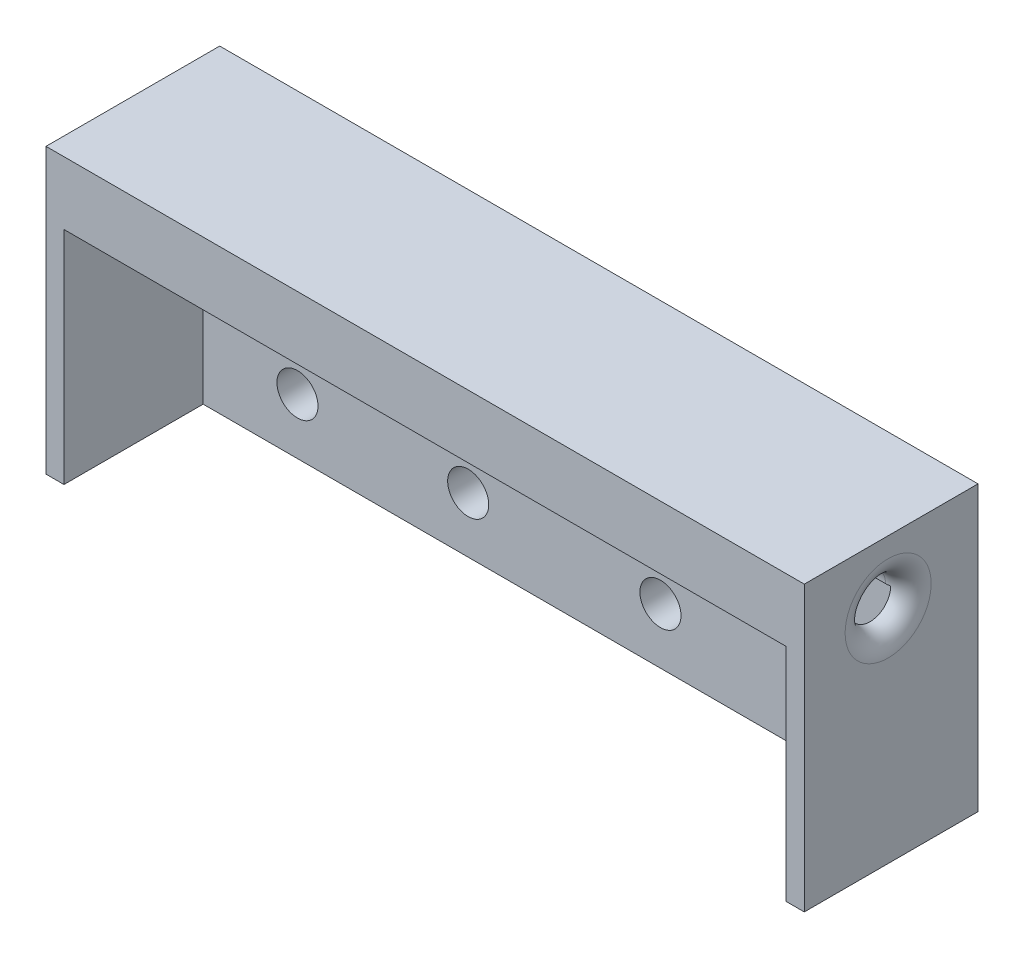
ISO-10303-21;
HEADER;
FILE_DESCRIPTION(('STEP AP214'),'2;1');
FILE_NAME('part.step','',(''),(''),'','','');
FILE_SCHEMA(('AUTOMOTIVE_DESIGN { 1 0 10303 214 1 1 1 1 }'));
ENDSEC;
DATA;
#1=APPLICATION_CONTEXT('core data for automotive mechanical design processes');
#2=APPLICATION_PROTOCOL_DEFINITION('international standard','automotive_design',2000,#1);
#3=PRODUCT_CONTEXT('',#1,'mechanical');
#4=PRODUCT('Part','Part','',(#3));
#5=PRODUCT_RELATED_PRODUCT_CATEGORY('part','',(#4));
#6=PRODUCT_DEFINITION_FORMATION('','',#4);
#7=PRODUCT_DEFINITION_CONTEXT('part definition',#1,'design');
#8=PRODUCT_DEFINITION('design','',#6,#7);
#9=PRODUCT_DEFINITION_SHAPE('','',#8);
#10=(LENGTH_UNIT() NAMED_UNIT(*) SI_UNIT(.MILLI.,.METRE.));
#11=(NAMED_UNIT(*) PLANE_ANGLE_UNIT() SI_UNIT($,.RADIAN.));
#12=(NAMED_UNIT(*) SI_UNIT($,.STERADIAN.) SOLID_ANGLE_UNIT());
#13=UNCERTAINTY_MEASURE_WITH_UNIT(LENGTH_MEASURE(1.E-05),#10,'distance_accuracy_value','');
#14=(GEOMETRIC_REPRESENTATION_CONTEXT(3) GLOBAL_UNCERTAINTY_ASSIGNED_CONTEXT((#13)) GLOBAL_UNIT_ASSIGNED_CONTEXT((#10,
#11,#12)) REPRESENTATION_CONTEXT('',''));
#15=CARTESIAN_POINT('',(0.,0.,0.));
#16=DIRECTION('',(0.,0.,1.));
#17=DIRECTION('',(1.,0.,0.));
#18=AXIS2_PLACEMENT_3D('',#15,#16,#17);
#19=CARTESIAN_POINT('',(0.,0.,9.66666666666667));
#20=DIRECTION('',(1.,0.,0.));
#21=DIRECTION('',(0.,0.,-1.));
#22=AXIS2_PLACEMENT_3D('',#19,#20,#21);
#23=PLANE('',#22);
#24=CARTESIAN_POINT('',(0.,12.3,5.));
#25=DIRECTION('',(1.,0.,0.));
#26=DIRECTION('',(0.,0.,-1.));
#27=AXIS2_PLACEMENT_3D('',#24,#25,#26);
#28=CIRCLE('',#27,2.395);
#29=CARTESIAN_POINT('',(0.,12.3,2.605));
#30=VERTEX_POINT('',#29);
#31=EDGE_CURVE('E244',#30,#30,#28,.T.);
#32=ORIENTED_EDGE('',*,*,#31,.T.);
#33=EDGE_LOOP('',(#32));
#34=FACE_BOUND('',#33,.T.);
#35=DIRECTION('',(0.,-1.,0.));
#36=VECTOR('',#35,1.);
#37=CARTESIAN_POINT('',(0.,0.,0.));
#38=LINE('',#37,#36);
#39=CARTESIAN_POINT('',(0.,15.8,0.));
#40=VERTEX_POINT('',#39);
#41=CARTESIAN_POINT('',(0.,0.,0.));
#42=VERTEX_POINT('',#41);
#43=EDGE_CURVE('E158',#40,#42,#38,.T.);
#44=ORIENTED_EDGE('',*,*,#43,.T.);
#45=DIRECTION('',(0.,0.,-1.));
#46=VECTOR('',#45,1.);
#47=CARTESIAN_POINT('',(0.,0.,9.66666666666667));
#48=LINE('',#47,#46);
#49=CARTESIAN_POINT('',(0.,0.,9.66666666666667));
#50=VERTEX_POINT('',#49);
#51=EDGE_CURVE('E234',#50,#42,#48,.T.);
#52=ORIENTED_EDGE('',*,*,#51,.F.);
#53=DIRECTION('',(0.,-1.,0.));
#54=VECTOR('',#53,1.);
#55=CARTESIAN_POINT('',(0.,0.,9.66666666666667));
#56=LINE('',#55,#54);
#57=CARTESIAN_POINT('',(0.,15.8,9.66666666666667));
#58=VERTEX_POINT('',#57);
#59=EDGE_CURVE('E195',#58,#50,#56,.T.);
#60=ORIENTED_EDGE('',*,*,#59,.F.);
#61=DIRECTION('',(0.,0.,-1.));
#62=VECTOR('',#61,1.);
#63=CARTESIAN_POINT('',(0.,15.8,9.66666666666667));
#64=LINE('',#63,#62);
#65=EDGE_CURVE('E211',#58,#40,#64,.T.);
#66=ORIENTED_EDGE('',*,*,#65,.T.);
#67=EDGE_LOOP('',(#44,#52,#60,#66));
#68=FACE_BOUND('',#67,.T.);
#69=ADVANCED_FACE('F45',(#34,#68),#23,.F.);
#70=CARTESIAN_POINT('',(0.,0.,9.66666666666667));
#71=DIRECTION('',(0.,1.,0.));
#72=DIRECTION('',(0.,0.,1.));
#73=AXIS2_PLACEMENT_3D('',#70,#71,#72);
#74=PLANE('',#73);
#75=DIRECTION('',(1.,0.,0.));
#76=VECTOR('',#75,1.);
#77=CARTESIAN_POINT('',(0.,0.,9.66666666666667));
#78=LINE('',#77,#76);
#79=CARTESIAN_POINT('',(41.1894,0.,9.66666666666667));
#80=VERTEX_POINT('',#79);
#81=CARTESIAN_POINT('',(42.2,0.,9.66666666666667));
#82=VERTEX_POINT('',#81);
#83=EDGE_CURVE('E199',#80,#82,#78,.T.);
#84=ORIENTED_EDGE('',*,*,#83,.F.);
#85=DIRECTION('',(0.,0.,1.));
#86=VECTOR('',#85,1.);
#87=CARTESIAN_POINT('',(41.1894,0.,1.92110906866666));
#88=LINE('',#87,#86);
#89=CARTESIAN_POINT('',(41.1894,0.,1.92110906866666));
#90=VERTEX_POINT('',#89);
#91=EDGE_CURVE('E192',#90,#80,#88,.T.);
#92=ORIENTED_EDGE('',*,*,#91,.F.);
#93=DIRECTION('',(1.,0.,0.));
#94=VECTOR('',#93,1.);
#95=CARTESIAN_POINT('',(1.,0.,1.92110906866666));
#96=LINE('',#95,#94);
#97=CARTESIAN_POINT('',(1.,0.,1.92110906866666));
#98=VERTEX_POINT('',#97);
#99=EDGE_CURVE('E163',#98,#90,#96,.T.);
#100=ORIENTED_EDGE('',*,*,#99,.F.);
#101=DIRECTION('',(0.,0.,1.));
#102=VECTOR('',#101,1.);
#103=CARTESIAN_POINT('',(1.,0.,1.92110906866666));
#104=LINE('',#103,#102);
#105=CARTESIAN_POINT('',(1.,0.,9.66666666666667));
#106=VERTEX_POINT('',#105);
#107=EDGE_CURVE('E188',#98,#106,#104,.T.);
#108=ORIENTED_EDGE('',*,*,#107,.T.);
#109=EDGE_CURVE('E201',#50,#106,#78,.T.);
#110=ORIENTED_EDGE('',*,*,#109,.F.);
#111=ORIENTED_EDGE('',*,*,#51,.T.);
#112=DIRECTION('',(1.,0.,0.));
#113=VECTOR('',#112,1.);
#114=CARTESIAN_POINT('',(0.,0.,0.));
#115=LINE('',#114,#113);
#116=CARTESIAN_POINT('',(42.2,0.,0.));
#117=VERTEX_POINT('',#116);
#118=EDGE_CURVE('E215',#42,#117,#115,.T.);
#119=ORIENTED_EDGE('',*,*,#118,.T.);
#120=DIRECTION('',(0.,0.,-1.));
#121=VECTOR('',#120,1.);
#122=CARTESIAN_POINT('',(42.2,0.,9.66666666666667));
#123=LINE('',#122,#121);
#124=EDGE_CURVE('E230',#82,#117,#123,.T.);
#125=ORIENTED_EDGE('',*,*,#124,.F.);
#126=EDGE_LOOP('',(#84,#92,#100,#108,#110,#111,#119,#125));
#127=FACE_BOUND('',#126,.T.);
#128=ADVANCED_FACE('F303',(#127),#74,.F.);
#129=CARTESIAN_POINT('',(42.2,0.,9.66666666666667));
#130=DIRECTION('',(-1.,0.,0.));
#131=DIRECTION('',(0.,0.,1.));
#132=AXIS2_PLACEMENT_3D('',#129,#130,#131);
#133=PLANE('',#132);
#134=CARTESIAN_POINT('',(42.2,12.3,5.));
#135=DIRECTION('',(-1.,0.,0.));
#136=DIRECTION('',(0.,0.,1.));
#137=AXIS2_PLACEMENT_3D('',#134,#135,#136);
#138=CIRCLE('',#137,2.395);
#139=CARTESIAN_POINT('',(42.2,12.3,7.395));
#140=VERTEX_POINT('',#139);
#141=EDGE_CURVE('E56',#140,#140,#138,.T.);
#142=ORIENTED_EDGE('',*,*,#141,.T.);
#143=EDGE_LOOP('',(#142));
#144=FACE_BOUND('',#143,.T.);
#145=DIRECTION('',(0.,1.,0.));
#146=VECTOR('',#145,1.);
#147=CARTESIAN_POINT('',(42.2,0.,0.));
#148=LINE('',#147,#146);
#149=CARTESIAN_POINT('',(42.2,15.8,0.));
#150=VERTEX_POINT('',#149);
#151=EDGE_CURVE('E218',#117,#150,#148,.T.);
#152=ORIENTED_EDGE('',*,*,#151,.T.);
#153=DIRECTION('',(0.,0.,-1.));
#154=VECTOR('',#153,1.);
#155=CARTESIAN_POINT('',(42.2,15.8,9.66666666666667));
#156=LINE('',#155,#154);
#157=CARTESIAN_POINT('',(42.2,15.8,9.66666666666667));
#158=VERTEX_POINT('',#157);
#159=EDGE_CURVE('E226',#158,#150,#156,.T.);
#160=ORIENTED_EDGE('',*,*,#159,.F.);
#161=DIRECTION('',(0.,1.,0.));
#162=VECTOR('',#161,1.);
#163=CARTESIAN_POINT('',(42.2,0.,9.66666666666667));
#164=LINE('',#163,#162);
#165=EDGE_CURVE('E205',#82,#158,#164,.T.);
#166=ORIENTED_EDGE('',*,*,#165,.F.);
#167=ORIENTED_EDGE('',*,*,#124,.T.);
#168=EDGE_LOOP('',(#152,#160,#166,#167));
#169=FACE_BOUND('',#168,.T.);
#170=ADVANCED_FACE('F307',(#144,#169),#133,.F.);
#171=CARTESIAN_POINT('',(0.,15.8,9.66666666666667));
#172=DIRECTION('',(0.,-1.,0.));
#173=DIRECTION('',(0.,0.,-1.));
#174=AXIS2_PLACEMENT_3D('',#171,#172,#173);
#175=PLANE('',#174);
#176=DIRECTION('',(-1.,0.,0.));
#177=VECTOR('',#176,1.);
#178=CARTESIAN_POINT('',(0.,15.8,0.));
#179=LINE('',#178,#177);
#180=EDGE_CURVE('E200',#150,#40,#179,.T.);
#181=ORIENTED_EDGE('',*,*,#180,.T.);
#182=ORIENTED_EDGE('',*,*,#65,.F.);
#183=DIRECTION('',(-1.,0.,0.));
#184=VECTOR('',#183,1.);
#185=CARTESIAN_POINT('',(0.,15.8,9.66666666666667));
#186=LINE('',#185,#184);
#187=EDGE_CURVE('E208',#158,#58,#186,.T.);
#188=ORIENTED_EDGE('',*,*,#187,.F.);
#189=ORIENTED_EDGE('',*,*,#159,.T.);
#190=EDGE_LOOP('',(#181,#182,#188,#189));
#191=FACE_BOUND('',#190,.T.);
#192=ADVANCED_FACE('F311',(#191),#175,.F.);
#193=CARTESIAN_POINT('',(0.,0.,9.66666666666667));
#194=DIRECTION('',(0.,0.,-1.));
#195=DIRECTION('',(-1.,0.,0.));
#196=AXIS2_PLACEMENT_3D('',#193,#194,#195);
#197=PLANE('',#196);
#198=DIRECTION('',(1.,0.,0.));
#199=VECTOR('',#198,1.);
#200=CARTESIAN_POINT('',(1.,12.2936,9.66666666666667));
#201=LINE('',#200,#199);
#202=CARTESIAN_POINT('',(1.,12.2936,9.66666666666667));
#203=VERTEX_POINT('',#202);
#204=CARTESIAN_POINT('',(41.1894,12.2936,9.66666666666667));
#205=VERTEX_POINT('',#204);
#206=EDGE_CURVE('E175',#203,#205,#201,.T.);
#207=ORIENTED_EDGE('',*,*,#206,.T.);
#208=DIRECTION('',(0.,1.,0.));
#209=VECTOR('',#208,1.);
#210=CARTESIAN_POINT('',(41.1894,0.,9.66666666666667));
#211=LINE('',#210,#209);
#212=EDGE_CURVE('E179',#80,#205,#211,.T.);
#213=ORIENTED_EDGE('',*,*,#212,.F.);
#214=ORIENTED_EDGE('',*,*,#83,.T.);
#215=ORIENTED_EDGE('',*,*,#165,.T.);
#216=ORIENTED_EDGE('',*,*,#187,.T.);
#217=ORIENTED_EDGE('',*,*,#59,.T.);
#218=ORIENTED_EDGE('',*,*,#109,.T.);
#219=DIRECTION('',(0.,1.,0.));
#220=VECTOR('',#219,1.);
#221=CARTESIAN_POINT('',(1.,0.,9.66666666666667));
#222=LINE('',#221,#220);
#223=EDGE_CURVE('E151',#106,#203,#222,.T.);
#224=ORIENTED_EDGE('',*,*,#223,.T.);
#225=EDGE_LOOP('',(#207,#213,#214,#215,#216,#217,#218,#224));
#226=FACE_BOUND('',#225,.T.);
#227=ADVANCED_FACE('F315',(#226),#197,.F.);
#228=CARTESIAN_POINT('',(0.,0.,0.));
#229=DIRECTION('',(0.,0.,-1.));
#230=DIRECTION('',(-1.,0.,0.));
#231=AXIS2_PLACEMENT_3D('',#228,#229,#230);
#232=PLANE('',#231);
#233=CARTESIAN_POINT('',(6.25,3.1,0.));
#234=DIRECTION('',(0.,0.,1.));
#235=DIRECTION('',(1.,0.,0.));
#236=AXIS2_PLACEMENT_3D('',#233,#234,#235);
#237=CIRCLE('',#236,1.143);
#238=CARTESIAN_POINT('',(7.393,3.1,0.));
#239=VERTEX_POINT('',#238);
#240=EDGE_CURVE('E486',#239,#239,#237,.T.);
#241=ORIENTED_EDGE('',*,*,#240,.T.);
#242=EDGE_LOOP('',(#241));
#243=FACE_BOUND('',#242,.T.);
#244=CARTESIAN_POINT('',(15.75,3.1,0.));
#245=DIRECTION('',(0.,0.,1.));
#246=DIRECTION('',(1.,0.,0.));
#247=AXIS2_PLACEMENT_3D('',#244,#245,#246);
#248=CIRCLE('',#247,1.143);
#249=CARTESIAN_POINT('',(16.893,3.1,0.));
#250=VERTEX_POINT('',#249);
#251=EDGE_CURVE('E489',#250,#250,#248,.T.);
#252=ORIENTED_EDGE('',*,*,#251,.T.);
#253=EDGE_LOOP('',(#252));
#254=FACE_BOUND('',#253,.T.);
#255=CARTESIAN_POINT('',(26.45,3.1,0.));
#256=DIRECTION('',(0.,0.,1.));
#257=DIRECTION('',(1.,0.,0.));
#258=AXIS2_PLACEMENT_3D('',#255,#256,#257);
#259=CIRCLE('',#258,1.143);
#260=CARTESIAN_POINT('',(27.593,3.1,0.));
#261=VERTEX_POINT('',#260);
#262=EDGE_CURVE('E496',#261,#261,#259,.T.);
#263=ORIENTED_EDGE('',*,*,#262,.T.);
#264=EDGE_LOOP('',(#263));
#265=FACE_BOUND('',#264,.T.);
#266=CARTESIAN_POINT('',(35.95,3.1,0.));
#267=DIRECTION('',(0.,0.,1.));
#268=DIRECTION('',(1.,0.,0.));
#269=AXIS2_PLACEMENT_3D('',#266,#267,#268);
#270=CIRCLE('',#269,1.143);
#271=CARTESIAN_POINT('',(37.093,3.1,0.));
#272=VERTEX_POINT('',#271);
#273=EDGE_CURVE('E501',#272,#272,#270,.T.);
#274=ORIENTED_EDGE('',*,*,#273,.T.);
#275=EDGE_LOOP('',(#274));
#276=FACE_BOUND('',#275,.T.);
#277=ORIENTED_EDGE('',*,*,#43,.F.);
#278=ORIENTED_EDGE('',*,*,#180,.F.);
#279=ORIENTED_EDGE('',*,*,#151,.F.);
#280=ORIENTED_EDGE('',*,*,#118,.F.);
#281=EDGE_LOOP('',(#277,#278,#279,#280));
#282=FACE_BOUND('',#281,.T.);
#283=ADVANCED_FACE('F317',(#243,#254,#265,#276,#282),#232,.T.);
#284=CARTESIAN_POINT('',(0.,12.3,5.));
#285=DIRECTION('',(1.,0.,0.));
#286=DIRECTION('',(0.,0.,-1.));
#287=AXIS2_PLACEMENT_3D('',#284,#285,#286);
#288=CYLINDRICAL_SURFACE('',#287,1.125);
#289=DIRECTION('',(1.,0.,0.));
#290=VECTOR('',#289,1.);
#291=CARTESIAN_POINT('',(0.,12.2936,6.12498179540827));
#292=LINE('',#291,#290);
#293=CARTESIAN_POINT('',(1.27,12.2936,6.12498179540827));
#294=VERTEX_POINT('',#293);
#295=CARTESIAN_POINT('',(40.93,12.2936,6.12498179540827));
#296=VERTEX_POINT('',#295);
#297=EDGE_CURVE('E238',#294,#296,#292,.T.);
#298=ORIENTED_EDGE('',*,*,#297,.F.);
#299=CARTESIAN_POINT('',(1.27,12.3,5.));
#300=DIRECTION('',(1.,0.,0.));
#301=DIRECTION('',(0.,0.,-1.));
#302=AXIS2_PLACEMENT_3D('',#299,#300,#301);
#303=CIRCLE('',#302,1.125);
#304=CARTESIAN_POINT('',(1.27,12.2936,3.87501820459173));
#305=VERTEX_POINT('',#304);
#306=EDGE_CURVE('E252',#294,#305,#303,.F.);
#307=ORIENTED_EDGE('',*,*,#306,.T.);
#308=DIRECTION('',(1.,0.,0.));
#309=VECTOR('',#308,1.);
#310=CARTESIAN_POINT('',(0.,12.2936,3.87501820459173));
#311=LINE('',#310,#309);
#312=CARTESIAN_POINT('',(40.93,12.2936,3.87501820459173));
#313=VERTEX_POINT('',#312);
#314=EDGE_CURVE('E241',#313,#305,#311,.F.);
#315=ORIENTED_EDGE('',*,*,#314,.F.);
#316=CARTESIAN_POINT('',(40.93,12.3,5.));
#317=DIRECTION('',(-1.,0.,0.));
#318=DIRECTION('',(0.,0.,1.));
#319=AXIS2_PLACEMENT_3D('',#316,#317,#318);
#320=CIRCLE('',#319,1.125);
#321=EDGE_CURVE('E248',#313,#296,#320,.F.);
#322=ORIENTED_EDGE('',*,*,#321,.T.);
#323=EDGE_LOOP('',(#298,#307,#315,#322));
#324=FACE_BOUND('',#323,.T.);
#325=ADVANCED_FACE('F275',(#324),#288,.F.);
#326=CARTESIAN_POINT('',(1.,12.2936,1.92110906866666));
#327=DIRECTION('',(0.,-1.,0.));
#328=DIRECTION('',(0.,0.,-1.));
#329=AXIS2_PLACEMENT_3D('',#326,#327,#328);
#330=PLANE('',#329);
#331=ORIENTED_EDGE('',*,*,#314,.T.);
#332=CARTESIAN_POINT('',(1.27,12.2936,3.87501820459173));
#333=CARTESIAN_POINT('',(1.22448117449185,12.2936,3.87500429410601));
#334=CARTESIAN_POINT('',(1.17922176173839,12.2936,3.87257791441404));
#335=CARTESIAN_POINT('',(1.08922176173836,12.2936,3.86290021661731));
#336=CARTESIAN_POINT('',(1.04448117449182,12.2936,3.85564889851228));
#337=CARTESIAN_POINT('',(1.,12.2936,3.84598511120073));
#338=B_SPLINE_CURVE_WITH_KNOTS('',3,(#332,#333,#334,#335,#336,#337),.UNSPECIFIED.,.F.,.F.,(4,2,
4),(0.,0.135973217402466,0.271946434812479),.UNSPECIFIED.);
#339=CARTESIAN_POINT('',(1.,12.2936,3.84598511120073));
#340=VERTEX_POINT('',#339);
#341=EDGE_CURVE('E264',#305,#340,#338,.T.);
#342=ORIENTED_EDGE('',*,*,#341,.T.);
#343=DIRECTION('',(0.,0.,1.));
#344=VECTOR('',#343,1.);
#345=CARTESIAN_POINT('',(1.,12.2936,1.92110906866666));
#346=LINE('',#345,#344);
#347=CARTESIAN_POINT('',(1.,12.2936,1.92110906866666));
#348=VERTEX_POINT('',#347);
#349=EDGE_CURVE('E145',#348,#340,#346,.T.);
#350=ORIENTED_EDGE('',*,*,#349,.F.);
#351=DIRECTION('',(1.,0.,0.));
#352=VECTOR('',#351,1.);
#353=CARTESIAN_POINT('',(1.,12.2936,1.92110906866666));
#354=LINE('',#353,#352);
#355=CARTESIAN_POINT('',(41.1894,12.2936,1.92110906866666));
#356=VERTEX_POINT('',#355);
#357=EDGE_CURVE('E139',#348,#356,#354,.T.);
#358=ORIENTED_EDGE('',*,*,#357,.T.);
#359=DIRECTION('',(0.,0.,1.));
#360=VECTOR('',#359,1.);
#361=CARTESIAN_POINT('',(41.1894,12.2936,1.92110906866666));
#362=LINE('',#361,#360);
#363=CARTESIAN_POINT('',(41.1894,12.2936,3.8482440842186));
#364=VERTEX_POINT('',#363);
#365=EDGE_CURVE('E143',#356,#364,#362,.T.);
#366=ORIENTED_EDGE('',*,*,#365,.T.);
#367=CARTESIAN_POINT('',(41.1894,12.2936,3.8482440842186));
#368=CARTESIAN_POINT('',(41.1466260305433,12.2936,3.85715696626627));
#369=CARTESIAN_POINT('',(41.1036223791479,12.2936,3.86384458398786));
#370=CARTESIAN_POINT('',(41.0171557124812,12.2936,3.87276929077871));
#371=CARTESIAN_POINT('',(40.97369269721,12.2936,3.87500637984816));
#372=CARTESIAN_POINT('',(40.93,12.2936,3.87501820459173));
#373=B_SPLINE_CURVE_WITH_KNOTS('',3,(#367,#368,#369,#370,#371,#372),.UNSPECIFIED.,.F.,.F.,(4,2,
4),(0.,0.130561649718449,0.261123299431207),.UNSPECIFIED.);
#374=EDGE_CURVE('E256',#364,#313,#373,.T.);
#375=ORIENTED_EDGE('',*,*,#374,.T.);
#376=EDGE_LOOP('',(#331,#342,#350,#358,#366,#375));
#377=FACE_BOUND('',#376,.T.);
#378=ADVANCED_FACE('F142',(#377),#330,.T.);
#379=CARTESIAN_POINT('',(1.,12.2936,6.15401488879927));
#380=VERTEX_POINT('',#379);
#381=EDGE_CURVE('E174',#380,#203,#346,.T.);
#382=ORIENTED_EDGE('',*,*,#381,.F.);
#383=CARTESIAN_POINT('',(1.,12.2936,6.15401488879927));
#384=CARTESIAN_POINT('',(1.04448117449182,12.2936,6.14435110148772));
#385=CARTESIAN_POINT('',(1.08922176173836,12.2936,6.13709978338269));
#386=CARTESIAN_POINT('',(1.17922176173839,12.2936,6.12742208558596));
#387=CARTESIAN_POINT('',(1.22448117449185,12.2936,6.12499570589399));
#388=CARTESIAN_POINT('',(1.27,12.2936,6.12498179540827));
#389=B_SPLINE_CURVE_WITH_KNOTS('',3,(#383,#384,#385,#386,#387,#388),.UNSPECIFIED.,.F.,.F.,(4,2,
4),(0.,0.135973217410013,0.271946434812478),.UNSPECIFIED.);
#390=EDGE_CURVE('E288',#380,#294,#389,.T.);
#391=ORIENTED_EDGE('',*,*,#390,.T.);
#392=ORIENTED_EDGE('',*,*,#297,.T.);
#393=CARTESIAN_POINT('',(40.93,12.2936,6.12498179540827));
#394=CARTESIAN_POINT('',(40.97369269721,12.2936,6.12499362015184));
#395=CARTESIAN_POINT('',(41.0171557124812,12.2936,6.12723070922129));
#396=CARTESIAN_POINT('',(41.1036223791479,12.2936,6.13615541601214));
#397=CARTESIAN_POINT('',(41.1466260305433,12.2936,6.14284303373373));
#398=CARTESIAN_POINT('',(41.1894,12.2936,6.1517559157814));
#399=B_SPLINE_CURVE_WITH_KNOTS('',3,(#393,#394,#395,#396,#397,#398),.UNSPECIFIED.,.F.,.F.,(4,2,
4),(0.,0.130561649712758,0.261123299431207),.UNSPECIFIED.);
#400=CARTESIAN_POINT('',(41.1894,12.2936,6.1517559157814));
#401=VERTEX_POINT('',#400);
#402=EDGE_CURVE('E64',#296,#401,#399,.T.);
#403=ORIENTED_EDGE('',*,*,#402,.T.);
#404=EDGE_CURVE('E159',#401,#205,#362,.T.);
#405=ORIENTED_EDGE('',*,*,#404,.T.);
#406=ORIENTED_EDGE('',*,*,#206,.F.);
#407=EDGE_LOOP('',(#382,#391,#392,#403,#405,#406));
#408=FACE_BOUND('',#407,.T.);
#409=ADVANCED_FACE('F274',(#408),#330,.T.);
#410=CARTESIAN_POINT('',(41.1894,0.,1.92110906866666));
#411=DIRECTION('',(1.,0.,0.));
#412=DIRECTION('',(0.,0.,-1.));
#413=AXIS2_PLACEMENT_3D('',#410,#411,#412);
#414=PLANE('',#413);
#415=ORIENTED_EDGE('',*,*,#404,.F.);
#416=CARTESIAN_POINT('',(41.1894,12.3,5.));
#417=DIRECTION('',(-1.,0.,0.));
#418=DIRECTION('',(0.,0.,1.));
#419=AXIS2_PLACEMENT_3D('',#416,#417,#418);
#420=CIRCLE('',#419,1.15177369718945);
#421=EDGE_CURVE('E11',#401,#364,#420,.F.);
#422=ORIENTED_EDGE('',*,*,#421,.T.);
#423=ORIENTED_EDGE('',*,*,#365,.F.);
#424=DIRECTION('',(0.,1.,0.));
#425=VECTOR('',#424,1.);
#426=CARTESIAN_POINT('',(41.1894,0.,1.92110906866666));
#427=LINE('',#426,#425);
#428=EDGE_CURVE('E150',#90,#356,#427,.T.);
#429=ORIENTED_EDGE('',*,*,#428,.F.);
#430=ORIENTED_EDGE('',*,*,#91,.T.);
#431=ORIENTED_EDGE('',*,*,#212,.T.);
#432=EDGE_LOOP('',(#415,#422,#423,#429,#430,#431));
#433=FACE_BOUND('',#432,.T.);
#434=ADVANCED_FACE('F154',(#433),#414,.F.);
#435=CARTESIAN_POINT('',(1.,0.,1.92110906866666));
#436=DIRECTION('',(1.,0.,0.));
#437=DIRECTION('',(0.,0.,-1.));
#438=AXIS2_PLACEMENT_3D('',#435,#436,#437);
#439=PLANE('',#438);
#440=ORIENTED_EDGE('',*,*,#349,.T.);
#441=CARTESIAN_POINT('',(1.,12.3,5.));
#442=DIRECTION('',(1.,0.,0.));
#443=DIRECTION('',(0.,0.,-1.));
#444=AXIS2_PLACEMENT_3D('',#441,#442,#443);
#445=CIRCLE('',#444,1.15403263540092);
#446=EDGE_CURVE('E72',#340,#380,#445,.F.);
#447=ORIENTED_EDGE('',*,*,#446,.T.);
#448=ORIENTED_EDGE('',*,*,#381,.T.);
#449=ORIENTED_EDGE('',*,*,#223,.F.);
#450=ORIENTED_EDGE('',*,*,#107,.F.);
#451=DIRECTION('',(0.,1.,0.));
#452=VECTOR('',#451,1.);
#453=CARTESIAN_POINT('',(1.,0.,1.92110906866666));
#454=LINE('',#453,#452);
#455=EDGE_CURVE('E168',#98,#348,#454,.T.);
#456=ORIENTED_EDGE('',*,*,#455,.T.);
#457=EDGE_LOOP('',(#440,#447,#448,#449,#450,#456));
#458=FACE_BOUND('',#457,.T.);
#459=ADVANCED_FACE('F333',(#458),#439,.T.);
#460=CARTESIAN_POINT('',(0.,0.,1.92110906866666));
#461=DIRECTION('',(0.,0.,1.));
#462=DIRECTION('',(1.,0.,0.));
#463=AXIS2_PLACEMENT_3D('',#460,#461,#462);
#464=PLANE('',#463);
#465=CARTESIAN_POINT('',(6.25,3.1,1.92110906866666));
#466=DIRECTION('',(0.,0.,1.));
#467=DIRECTION('',(1.,0.,0.));
#468=AXIS2_PLACEMENT_3D('',#465,#466,#467);
#469=CIRCLE('',#468,1.143);
#470=CARTESIAN_POINT('',(7.393,3.1,1.92110906866666));
#471=VERTEX_POINT('',#470);
#472=EDGE_CURVE('E50',#471,#471,#469,.T.);
#473=ORIENTED_EDGE('',*,*,#472,.F.);
#474=EDGE_LOOP('',(#473));
#475=FACE_BOUND('',#474,.T.);
#476=CARTESIAN_POINT('',(15.75,3.1,1.92110906866666));
#477=DIRECTION('',(0.,0.,1.));
#478=DIRECTION('',(1.,0.,0.));
#479=AXIS2_PLACEMENT_3D('',#476,#477,#478);
#480=CIRCLE('',#479,1.143);
#481=CARTESIAN_POINT('',(16.893,3.1,1.92110906866666));
#482=VERTEX_POINT('',#481);
#483=EDGE_CURVE('E515',#482,#482,#480,.T.);
#484=ORIENTED_EDGE('',*,*,#483,.F.);
#485=EDGE_LOOP('',(#484));
#486=FACE_BOUND('',#485,.T.);
#487=CARTESIAN_POINT('',(26.45,3.1,1.92110906866666));
#488=DIRECTION('',(0.,0.,1.));
#489=DIRECTION('',(1.,0.,0.));
#490=AXIS2_PLACEMENT_3D('',#487,#488,#489);
#491=CIRCLE('',#490,1.143);
#492=CARTESIAN_POINT('',(27.593,3.1,1.92110906866666));
#493=VERTEX_POINT('',#492);
#494=EDGE_CURVE('E493',#493,#493,#491,.T.);
#495=ORIENTED_EDGE('',*,*,#494,.F.);
#496=EDGE_LOOP('',(#495));
#497=FACE_BOUND('',#496,.T.);
#498=CARTESIAN_POINT('',(35.95,3.1,1.92110906866666));
#499=DIRECTION('',(0.,0.,1.));
#500=DIRECTION('',(1.,0.,0.));
#501=AXIS2_PLACEMENT_3D('',#498,#499,#500);
#502=CIRCLE('',#501,1.143);
#503=CARTESIAN_POINT('',(37.093,3.1,1.92110906866666));
#504=VERTEX_POINT('',#503);
#505=EDGE_CURVE('E488',#504,#504,#502,.T.);
#506=ORIENTED_EDGE('',*,*,#505,.F.);
#507=EDGE_LOOP('',(#506));
#508=FACE_BOUND('',#507,.T.);
#509=ORIENTED_EDGE('',*,*,#357,.F.);
#510=ORIENTED_EDGE('',*,*,#455,.F.);
#511=ORIENTED_EDGE('',*,*,#99,.T.);
#512=ORIENTED_EDGE('',*,*,#428,.T.);
#513=EDGE_LOOP('',(#509,#510,#511,#512));
#514=FACE_BOUND('',#513,.T.);
#515=ADVANCED_FACE('F161',(#475,#486,#497,#508,#514),#464,.T.);
#516=CARTESIAN_POINT('',(1.27,12.3,5.));
#517=DIRECTION('',(1.,0.,0.));
#518=DIRECTION('',(0.,0.,-1.));
#519=AXIS2_PLACEMENT_3D('',#516,#517,#518);
#520=TOROIDAL_SURFACE('',#519,2.395,1.27);
#521=ORIENTED_EDGE('',*,*,#341,.F.);
#522=ORIENTED_EDGE('',*,*,#306,.F.);
#523=ORIENTED_EDGE('',*,*,#390,.F.);
#524=ORIENTED_EDGE('',*,*,#446,.F.);
#525=EDGE_LOOP('',(#521,#522,#523,#524));
#526=FACE_BOUND('',#525,.T.);
#527=ORIENTED_EDGE('',*,*,#31,.F.);
#528=EDGE_LOOP('',(#527));
#529=FACE_BOUND('',#528,.T.);
#530=ADVANCED_FACE('F295',(#526,#529),#520,.T.);
#531=CARTESIAN_POINT('',(40.93,12.3,5.));
#532=DIRECTION('',(-1.,0.,0.));
#533=DIRECTION('',(0.,0.,1.));
#534=AXIS2_PLACEMENT_3D('',#531,#532,#533);
#535=TOROIDAL_SURFACE('',#534,2.395,1.27);
#536=ORIENTED_EDGE('',*,*,#402,.F.);
#537=ORIENTED_EDGE('',*,*,#321,.F.);
#538=ORIENTED_EDGE('',*,*,#374,.F.);
#539=ORIENTED_EDGE('',*,*,#421,.F.);
#540=EDGE_LOOP('',(#536,#537,#538,#539));
#541=FACE_BOUND('',#540,.T.);
#542=ORIENTED_EDGE('',*,*,#141,.F.);
#543=EDGE_LOOP('',(#542));
#544=FACE_BOUND('',#543,.T.);
#545=ADVANCED_FACE('F47',(#541,#544),#535,.T.);
#546=CARTESIAN_POINT('',(35.95,3.1,0.));
#547=DIRECTION('',(0.,0.,1.));
#548=DIRECTION('',(1.,0.,0.));
#549=AXIS2_PLACEMENT_3D('',#546,#547,#548);
#550=CYLINDRICAL_SURFACE('',#549,1.143);
#551=ORIENTED_EDGE('',*,*,#505,.T.);
#552=EDGE_LOOP('',(#551));
#553=FACE_BOUND('',#552,.T.);
#554=ORIENTED_EDGE('',*,*,#273,.F.);
#555=EDGE_LOOP('',(#554));
#556=FACE_BOUND('',#555,.T.);
#557=ADVANCED_FACE('F356',(#553,#556),#550,.F.);
#558=CARTESIAN_POINT('',(26.45,3.1,0.));
#559=DIRECTION('',(0.,0.,1.));
#560=DIRECTION('',(1.,0.,0.));
#561=AXIS2_PLACEMENT_3D('',#558,#559,#560);
#562=CYLINDRICAL_SURFACE('',#561,1.143);
#563=ORIENTED_EDGE('',*,*,#494,.T.);
#564=EDGE_LOOP('',(#563));
#565=FACE_BOUND('',#564,.T.);
#566=ORIENTED_EDGE('',*,*,#262,.F.);
#567=EDGE_LOOP('',(#566));
#568=FACE_BOUND('',#567,.T.);
#569=ADVANCED_FACE('F363',(#565,#568),#562,.F.);
#570=CARTESIAN_POINT('',(15.75,3.1,0.));
#571=DIRECTION('',(0.,0.,1.));
#572=DIRECTION('',(1.,0.,0.));
#573=AXIS2_PLACEMENT_3D('',#570,#571,#572);
#574=CYLINDRICAL_SURFACE('',#573,1.143);
#575=ORIENTED_EDGE('',*,*,#483,.T.);
#576=EDGE_LOOP('',(#575));
#577=FACE_BOUND('',#576,.T.);
#578=ORIENTED_EDGE('',*,*,#251,.F.);
#579=EDGE_LOOP('',(#578));
#580=FACE_BOUND('',#579,.T.);
#581=ADVANCED_FACE('F370',(#577,#580),#574,.F.);
#582=CARTESIAN_POINT('',(6.25,3.1,0.));
#583=DIRECTION('',(0.,0.,1.));
#584=DIRECTION('',(1.,0.,0.));
#585=AXIS2_PLACEMENT_3D('',#582,#583,#584);
#586=CYLINDRICAL_SURFACE('',#585,1.143);
#587=ORIENTED_EDGE('',*,*,#472,.T.);
#588=EDGE_LOOP('',(#587));
#589=FACE_BOUND('',#588,.T.);
#590=ORIENTED_EDGE('',*,*,#240,.F.);
#591=EDGE_LOOP('',(#590));
#592=FACE_BOUND('',#591,.T.);
#593=ADVANCED_FACE('F469',(#589,#592),#586,.F.);
#594=CLOSED_SHELL('',(#69,#128,#170,#192,#227,#283,#325,#378,#409,#434,#459,#515,#530,#545,#557,
#569,#581,#593));
#595=MANIFOLD_SOLID_BREP('B2',#594);
#596=ADVANCED_BREP_SHAPE_REPRESENTATION('',(#18,#595),#14);
#597=SHAPE_DEFINITION_REPRESENTATION(#9,#596);
ENDSEC;
END-ISO-10303-21;
